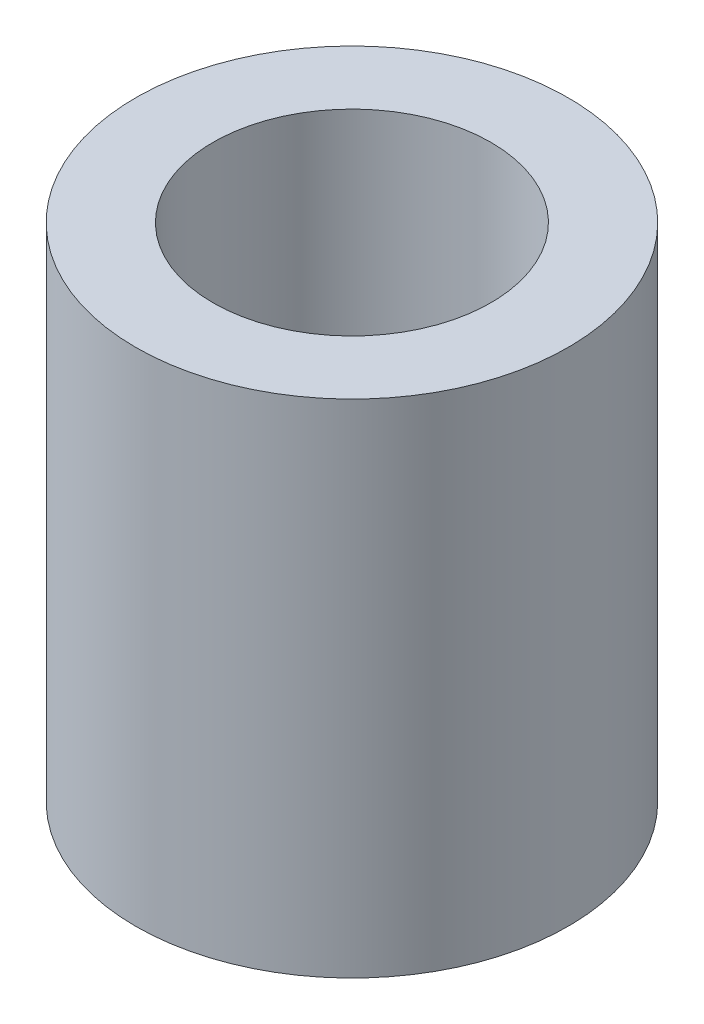
ISO-10303-21;
HEADER;
FILE_DESCRIPTION(('STEP AP214'),'2;1');
FILE_NAME('part.step','',(''),(''),'','','');
FILE_SCHEMA(('AUTOMOTIVE_DESIGN { 1 0 10303 214 1 1 1 1 }'));
ENDSEC;
DATA;
#1=APPLICATION_CONTEXT('core data for automotive mechanical design processes');
#2=APPLICATION_PROTOCOL_DEFINITION('international standard','automotive_design',2000,#1);
#3=PRODUCT_CONTEXT('',#1,'mechanical');
#4=PRODUCT('Part','Part','',(#3));
#5=PRODUCT_RELATED_PRODUCT_CATEGORY('part','',(#4));
#6=PRODUCT_DEFINITION_FORMATION('','',#4);
#7=PRODUCT_DEFINITION_CONTEXT('part definition',#1,'design');
#8=PRODUCT_DEFINITION('design','',#6,#7);
#9=PRODUCT_DEFINITION_SHAPE('','',#8);
#10=(LENGTH_UNIT() NAMED_UNIT(*) SI_UNIT(.MILLI.,.METRE.));
#11=(NAMED_UNIT(*) PLANE_ANGLE_UNIT() SI_UNIT($,.RADIAN.));
#12=(NAMED_UNIT(*) SI_UNIT($,.STERADIAN.) SOLID_ANGLE_UNIT());
#13=UNCERTAINTY_MEASURE_WITH_UNIT(LENGTH_MEASURE(1.E-05),#10,'distance_accuracy_value','');
#14=(GEOMETRIC_REPRESENTATION_CONTEXT(3) GLOBAL_UNCERTAINTY_ASSIGNED_CONTEXT((#13)) GLOBAL_UNIT_ASSIGNED_CONTEXT((#10,
#11,#12)) REPRESENTATION_CONTEXT('',''));
#15=CARTESIAN_POINT('',(0.,0.,0.));
#16=DIRECTION('',(0.,0.,1.));
#17=DIRECTION('',(1.,0.,0.));
#18=AXIS2_PLACEMENT_3D('',#15,#16,#17);
#19=CARTESIAN_POINT('',(0.,16.,0.));
#20=DIRECTION('',(0.,-1.,0.));
#21=DIRECTION('',(0.,0.,-1.));
#22=AXIS2_PLACEMENT_3D('',#19,#20,#21);
#23=CYLINDRICAL_SURFACE('',#22,6.9);
#24=CARTESIAN_POINT('',(0.,16.,0.));
#25=DIRECTION('',(0.,1.,0.));
#26=DIRECTION('',(0.,0.,1.));
#27=AXIS2_PLACEMENT_3D('',#24,#25,#26);
#28=CIRCLE('',#27,6.9);
#29=CARTESIAN_POINT('',(0.,16.,6.9));
#30=VERTEX_POINT('',#29);
#31=EDGE_CURVE('E11',#30,#30,#28,.T.);
#32=ORIENTED_EDGE('',*,*,#31,.F.);
#33=EDGE_LOOP('',(#32));
#34=FACE_BOUND('',#33,.T.);
#35=CARTESIAN_POINT('',(0.,0.,0.));
#36=DIRECTION('',(0.,1.,0.));
#37=DIRECTION('',(0.,0.,1.));
#38=AXIS2_PLACEMENT_3D('',#35,#36,#37);
#39=CIRCLE('',#38,6.9);
#40=CARTESIAN_POINT('',(0.,0.,6.9));
#41=VERTEX_POINT('',#40);
#42=EDGE_CURVE('E42',#41,#41,#39,.T.);
#43=ORIENTED_EDGE('',*,*,#42,.T.);
#44=EDGE_LOOP('',(#43));
#45=FACE_BOUND('',#44,.T.);
#46=ADVANCED_FACE('F39',(#34,#45),#23,.T.);
#47=CARTESIAN_POINT('',(0.,16.,0.));
#48=DIRECTION('',(0.,1.,0.));
#49=DIRECTION('',(0.,0.,1.));
#50=AXIS2_PLACEMENT_3D('',#47,#48,#49);
#51=PLANE('',#50);
#52=CARTESIAN_POINT('',(0.,16.,0.));
#53=DIRECTION('',(0.,1.,0.));
#54=DIRECTION('',(0.,0.,1.));
#55=AXIS2_PLACEMENT_3D('',#52,#53,#54);
#56=CIRCLE('',#55,4.435);
#57=CARTESIAN_POINT('',(0.,16.,4.435));
#58=VERTEX_POINT('',#57);
#59=EDGE_CURVE('E53',#58,#58,#56,.T.);
#60=ORIENTED_EDGE('',*,*,#59,.F.);
#61=EDGE_LOOP('',(#60));
#62=FACE_BOUND('',#61,.T.);
#63=ORIENTED_EDGE('',*,*,#31,.T.);
#64=EDGE_LOOP('',(#63));
#65=FACE_BOUND('',#64,.T.);
#66=ADVANCED_FACE('F59',(#62,#65),#51,.T.);
#67=CARTESIAN_POINT('',(0.,0.,0.));
#68=DIRECTION('',(0.,1.,0.));
#69=DIRECTION('',(0.,0.,1.));
#70=AXIS2_PLACEMENT_3D('',#67,#68,#69);
#71=PLANE('',#70);
#72=ORIENTED_EDGE('',*,*,#42,.F.);
#73=EDGE_LOOP('',(#72));
#74=FACE_BOUND('',#73,.T.);
#75=ADVANCED_FACE('F61',(#74),#71,.F.);
#76=CARTESIAN_POINT('',(0.,-12.5440742982494,0.));
#77=DIRECTION('',(0.,1.,0.));
#78=DIRECTION('',(0.,0.,1.));
#79=AXIS2_PLACEMENT_3D('',#76,#77,#78);
#80=CYLINDRICAL_SURFACE('',#79,4.435);
#81=CARTESIAN_POINT('',(0.,2.,0.));
#82=DIRECTION('',(0.,1.,0.));
#83=DIRECTION('',(0.,0.,1.));
#84=AXIS2_PLACEMENT_3D('',#81,#82,#83);
#85=CIRCLE('',#84,4.435);
#86=CARTESIAN_POINT('',(0.,2.,4.435));
#87=VERTEX_POINT('',#86);
#88=EDGE_CURVE('E49',#87,#87,#85,.F.);
#89=ORIENTED_EDGE('',*,*,#88,.T.);
#90=EDGE_LOOP('',(#89));
#91=FACE_BOUND('',#90,.T.);
#92=ORIENTED_EDGE('',*,*,#59,.T.);
#93=EDGE_LOOP('',(#92));
#94=FACE_BOUND('',#93,.T.);
#95=ADVANCED_FACE('F57',(#91,#94),#80,.F.);
#96=CARTESIAN_POINT('',(0.,2.,0.));
#97=DIRECTION('',(0.,1.,0.));
#98=DIRECTION('',(0.,0.,1.));
#99=AXIS2_PLACEMENT_3D('',#96,#97,#98);
#100=PLANE('',#99);
#101=ORIENTED_EDGE('',*,*,#88,.F.);
#102=EDGE_LOOP('',(#101));
#103=FACE_BOUND('',#102,.T.);
#104=ADVANCED_FACE('F72',(#103),#100,.T.);
#105=CLOSED_SHELL('',(#46,#66,#75,#95,#104));
#106=MANIFOLD_SOLID_BREP('B2',#105);
#107=ADVANCED_BREP_SHAPE_REPRESENTATION('',(#18,#106),#14);
#108=SHAPE_DEFINITION_REPRESENTATION(#9,#107);
ENDSEC;
END-ISO-10303-21;
